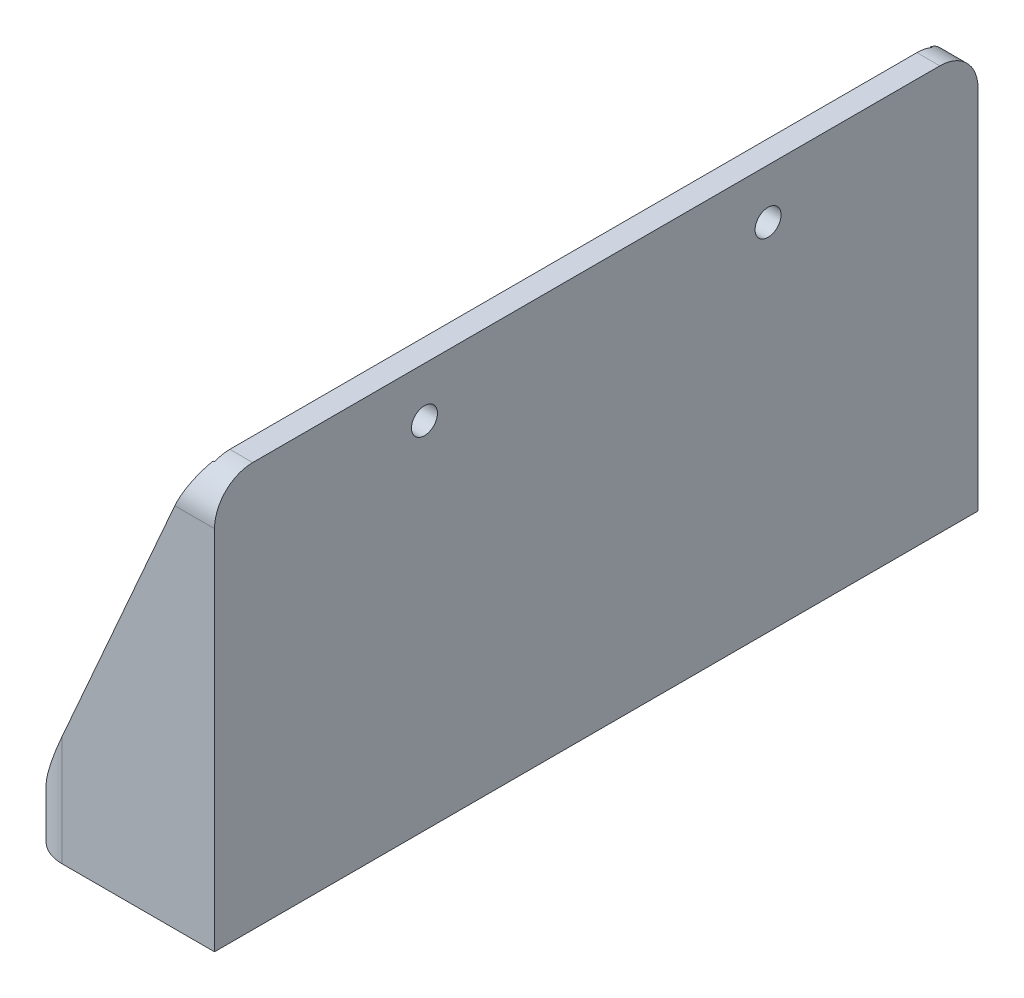
ISO-10303-21;
HEADER;
FILE_DESCRIPTION(('STEP AP214'),'2;1');
FILE_NAME('part.step','',(''),(''),'','','');
FILE_SCHEMA(('AUTOMOTIVE_DESIGN { 1 0 10303 214 1 1 1 1 }'));
ENDSEC;
DATA;
#1=APPLICATION_CONTEXT('core data for automotive mechanical design processes');
#2=APPLICATION_PROTOCOL_DEFINITION('international standard','automotive_design',2000,#1);
#3=PRODUCT_CONTEXT('',#1,'mechanical');
#4=PRODUCT('Part','Part','',(#3));
#5=PRODUCT_RELATED_PRODUCT_CATEGORY('part','',(#4));
#6=PRODUCT_DEFINITION_FORMATION('','',#4);
#7=PRODUCT_DEFINITION_CONTEXT('part definition',#1,'design');
#8=PRODUCT_DEFINITION('design','',#6,#7);
#9=PRODUCT_DEFINITION_SHAPE('','',#8);
#10=(LENGTH_UNIT() NAMED_UNIT(*) SI_UNIT(.MILLI.,.METRE.));
#11=(NAMED_UNIT(*) PLANE_ANGLE_UNIT() SI_UNIT($,.RADIAN.));
#12=(NAMED_UNIT(*) SI_UNIT($,.STERADIAN.) SOLID_ANGLE_UNIT());
#13=UNCERTAINTY_MEASURE_WITH_UNIT(LENGTH_MEASURE(1.E-05),#10,'distance_accuracy_value','');
#14=(GEOMETRIC_REPRESENTATION_CONTEXT(3) GLOBAL_UNCERTAINTY_ASSIGNED_CONTEXT((#13)) GLOBAL_UNIT_ASSIGNED_CONTEXT((#10,
#11,#12)) REPRESENTATION_CONTEXT('',''));
#15=CARTESIAN_POINT('',(0.,0.,0.));
#16=DIRECTION('',(0.,0.,1.));
#17=DIRECTION('',(1.,0.,0.));
#18=AXIS2_PLACEMENT_3D('',#15,#16,#17);
#19=CARTESIAN_POINT('',(0.,3.,0.));
#20=DIRECTION('',(0.,1.,0.));
#21=DIRECTION('',(0.,0.,1.));
#22=AXIS2_PLACEMENT_3D('',#19,#20,#21);
#23=PLANE('',#22);
#24=CARTESIAN_POINT('',(-1.5,3.,41.5792801519369));
#25=DIRECTION('',(0.,1.,0.));
#26=DIRECTION('',(0.,0.,1.));
#27=AXIS2_PLACEMENT_3D('',#24,#25,#26);
#28=CIRCLE('',#27,2.2);
#29=CARTESIAN_POINT('',(-1.5,3.,43.7792801519369));
#30=VERTEX_POINT('',#29);
#31=EDGE_CURVE('E258',#30,#30,#28,.T.);
#32=ORIENTED_EDGE('',*,*,#31,.F.);
#33=EDGE_LOOP('',(#32));
#34=FACE_BOUND('',#33,.T.);
#35=CARTESIAN_POINT('',(-1.5,3.,-38.4207198480631));
#36=DIRECTION('',(0.,1.,0.));
#37=DIRECTION('',(0.,0.,1.));
#38=AXIS2_PLACEMENT_3D('',#35,#36,#37);
#39=CIRCLE('',#38,2.2);
#40=CARTESIAN_POINT('',(-1.5,3.,-36.2207198480631));
#41=VERTEX_POINT('',#40);
#42=EDGE_CURVE('E261',#41,#41,#39,.T.);
#43=ORIENTED_EDGE('',*,*,#42,.F.);
#44=EDGE_LOOP('',(#43));
#45=FACE_BOUND('',#44,.T.);
#46=CARTESIAN_POINT('',(-1.5,3.,1.57928015193688));
#47=DIRECTION('',(0.,1.,0.));
#48=DIRECTION('',(0.,0.,1.));
#49=AXIS2_PLACEMENT_3D('',#46,#47,#48);
#50=CIRCLE('',#49,2.2);
#51=CARTESIAN_POINT('',(-1.5,3.,3.77928015193688));
#52=VERTEX_POINT('',#51);
#53=EDGE_CURVE('E264',#52,#52,#50,.T.);
#54=ORIENTED_EDGE('',*,*,#53,.F.);
#55=EDGE_LOOP('',(#54));
#56=FACE_BOUND('',#55,.T.);
#57=DIRECTION('',(0.,0.,1.));
#58=VECTOR('',#57,1.);
#59=CARTESIAN_POINT('',(-12.5,3.,50.));
#60=LINE('',#59,#58);
#61=CARTESIAN_POINT('',(-12.5,3.,-45.));
#62=VERTEX_POINT('',#61);
#63=CARTESIAN_POINT('',(-12.5,3.,45.));
#64=VERTEX_POINT('',#63);
#65=EDGE_CURVE('E286',#62,#64,#60,.T.);
#66=ORIENTED_EDGE('',*,*,#65,.T.);
#67=CARTESIAN_POINT('',(-7.5,3.,45.));
#68=DIRECTION('',(0.,1.,0.));
#69=DIRECTION('',(0.,0.,1.));
#70=AXIS2_PLACEMENT_3D('',#67,#68,#69);
#71=CIRCLE('',#70,5.);
#72=CARTESIAN_POINT('',(-12.0825756949558,3.,47.));
#73=VERTEX_POINT('',#72);
#74=EDGE_CURVE('E190',#64,#73,#71,.T.);
#75=ORIENTED_EDGE('',*,*,#74,.T.);
#76=DIRECTION('',(-1.,0.,0.));
#77=VECTOR('',#76,1.);
#78=CARTESIAN_POINT('',(0.,3.,47.));
#79=LINE('',#78,#77);
#80=CARTESIAN_POINT('',(4.50000000000001,3.,47.));
#81=VERTEX_POINT('',#80);
#82=EDGE_CURVE('E250',#81,#73,#79,.T.);
#83=ORIENTED_EDGE('',*,*,#82,.F.);
#84=DIRECTION('',(0.,0.,1.));
#85=VECTOR('',#84,1.);
#86=CARTESIAN_POINT('',(4.50000000000001,3.,0.));
#87=LINE('',#86,#85);
#88=CARTESIAN_POINT('',(4.50000000000001,3.,-47.));
#89=VERTEX_POINT('',#88);
#90=EDGE_CURVE('E164',#81,#89,#87,.F.);
#91=ORIENTED_EDGE('',*,*,#90,.T.);
#92=DIRECTION('',(-1.,0.,0.));
#93=VECTOR('',#92,1.);
#94=CARTESIAN_POINT('',(0.,3.,-47.));
#95=LINE('',#94,#93);
#96=CARTESIAN_POINT('',(-12.0825756949558,3.,-47.));
#97=VERTEX_POINT('',#96);
#98=EDGE_CURVE('E157',#89,#97,#95,.T.);
#99=ORIENTED_EDGE('',*,*,#98,.T.);
#100=CARTESIAN_POINT('',(-7.5,3.,-45.));
#101=DIRECTION('',(0.,1.,0.));
#102=DIRECTION('',(0.,0.,1.));
#103=AXIS2_PLACEMENT_3D('',#100,#101,#102);
#104=CIRCLE('',#103,5.);
#105=EDGE_CURVE('E188',#97,#62,#104,.T.);
#106=ORIENTED_EDGE('',*,*,#105,.T.);
#107=EDGE_LOOP('',(#66,#75,#83,#91,#99,#106));
#108=FACE_BOUND('',#107,.T.);
#109=ADVANCED_FACE('F35',(#34,#45,#56,#108),#23,.T.);
#110=CARTESIAN_POINT('',(9.5,53.,-50.));
#111=DIRECTION('',(1.,0.,0.));
#112=DIRECTION('',(0.,0.,-1.));
#113=AXIS2_PLACEMENT_3D('',#110,#111,#112);
#114=PLANE('',#113);
#115=CARTESIAN_POINT('',(9.5,46.5,-22.5));
#116=DIRECTION('',(-1.,0.,0.));
#117=DIRECTION('',(0.,0.,1.));
#118=AXIS2_PLACEMENT_3D('',#115,#116,#117);
#119=CIRCLE('',#118,1.7);
#120=CARTESIAN_POINT('',(9.5,46.5,-20.8));
#121=VERTEX_POINT('',#120);
#122=EDGE_CURVE('E270',#121,#121,#119,.T.);
#123=ORIENTED_EDGE('',*,*,#122,.F.);
#124=EDGE_LOOP('',(#123));
#125=FACE_BOUND('',#124,.T.);
#126=CARTESIAN_POINT('',(9.50000000000001,46.5,22.5));
#127=DIRECTION('',(-1.,0.,0.));
#128=DIRECTION('',(0.,0.,-1.));
#129=AXIS2_PLACEMENT_3D('',#126,#127,#128);
#130=CIRCLE('',#129,1.7);
#131=CARTESIAN_POINT('',(9.50000000000001,46.5,20.8));
#132=VERTEX_POINT('',#131);
#133=EDGE_CURVE('E274',#132,#132,#130,.T.);
#134=ORIENTED_EDGE('',*,*,#133,.F.);
#135=EDGE_LOOP('',(#134));
#136=FACE_BOUND('',#135,.T.);
#137=DIRECTION('',(0.,0.,1.));
#138=VECTOR('',#137,1.);
#139=CARTESIAN_POINT('',(9.5,53.,-50.));
#140=LINE('',#139,#138);
#141=CARTESIAN_POINT('',(9.5,53.,-45.));
#142=VERTEX_POINT('',#141);
#143=CARTESIAN_POINT('',(9.50000000000001,53.,45.));
#144=VERTEX_POINT('',#143);
#145=EDGE_CURVE('E283',#142,#144,#140,.T.);
#146=ORIENTED_EDGE('',*,*,#145,.F.);
#147=CARTESIAN_POINT('',(9.5,48.,-45.));
#148=DIRECTION('',(1.,0.,0.));
#149=DIRECTION('',(0.,0.,-1.));
#150=AXIS2_PLACEMENT_3D('',#147,#148,#149);
#151=CIRCLE('',#150,5.);
#152=CARTESIAN_POINT('',(9.50000000000001,52.5825756949558,-47.));
#153=VERTEX_POINT('',#152);
#154=EDGE_CURVE('E58',#142,#153,#151,.F.);
#155=ORIENTED_EDGE('',*,*,#154,.T.);
#156=DIRECTION('',(0.,-1.,0.));
#157=VECTOR('',#156,1.);
#158=CARTESIAN_POINT('',(9.50000000000001,0.,-47.));
#159=LINE('',#158,#157);
#160=CARTESIAN_POINT('',(9.50000000000001,8.,-47.));
#161=VERTEX_POINT('',#160);
#162=EDGE_CURVE('E143',#153,#161,#159,.T.);
#163=ORIENTED_EDGE('',*,*,#162,.T.);
#164=DIRECTION('',(0.,0.,1.));
#165=VECTOR('',#164,1.);
#166=CARTESIAN_POINT('',(9.5,8.,-50.));
#167=LINE('',#166,#165);
#168=CARTESIAN_POINT('',(9.50000000000001,8.,47.));
#169=VERTEX_POINT('',#168);
#170=EDGE_CURVE('E147',#161,#169,#167,.T.);
#171=ORIENTED_EDGE('',*,*,#170,.T.);
#172=DIRECTION('',(0.,-1.,0.));
#173=VECTOR('',#172,1.);
#174=CARTESIAN_POINT('',(9.50000000000001,0.,47.));
#175=LINE('',#174,#173);
#176=CARTESIAN_POINT('',(9.50000000000001,52.5825756949558,47.));
#177=VERTEX_POINT('',#176);
#178=EDGE_CURVE('E251',#177,#169,#175,.T.);
#179=ORIENTED_EDGE('',*,*,#178,.F.);
#180=CARTESIAN_POINT('',(9.50000000000001,48.,45.));
#181=DIRECTION('',(1.,0.,0.));
#182=DIRECTION('',(0.,0.,-1.));
#183=AXIS2_PLACEMENT_3D('',#180,#181,#182);
#184=CIRCLE('',#183,5.);
#185=EDGE_CURVE('E50',#177,#144,#184,.F.);
#186=ORIENTED_EDGE('',*,*,#185,.T.);
#187=EDGE_LOOP('',(#146,#155,#163,#171,#179,#186));
#188=FACE_BOUND('',#187,.T.);
#189=ADVANCED_FACE('F145',(#125,#136,#188),#114,.F.);
#190=CARTESIAN_POINT('',(4.5,8.,-50.));
#191=DIRECTION('',(0.,0.,1.));
#192=DIRECTION('',(1.,0.,0.));
#193=AXIS2_PLACEMENT_3D('',#190,#191,#192);
#194=CYLINDRICAL_SURFACE('',#193,5.);
#195=CARTESIAN_POINT('',(4.50000000000001,8.,-47.));
#196=DIRECTION('',(0.,0.,1.));
#197=DIRECTION('',(1.,0.,0.));
#198=AXIS2_PLACEMENT_3D('',#195,#196,#197);
#199=CIRCLE('',#198,5.);
#200=EDGE_CURVE('E150',#161,#89,#199,.F.);
#201=ORIENTED_EDGE('',*,*,#200,.T.);
#202=ORIENTED_EDGE('',*,*,#90,.F.);
#203=CARTESIAN_POINT('',(4.50000000000001,8.,47.));
#204=DIRECTION('',(0.,0.,1.));
#205=DIRECTION('',(1.,0.,0.));
#206=AXIS2_PLACEMENT_3D('',#203,#204,#205);
#207=CIRCLE('',#206,5.);
#208=EDGE_CURVE('E163',#169,#81,#207,.F.);
#209=ORIENTED_EDGE('',*,*,#208,.F.);
#210=ORIENTED_EDGE('',*,*,#170,.F.);
#211=EDGE_LOOP('',(#201,#202,#209,#210));
#212=FACE_BOUND('',#211,.T.);
#213=ADVANCED_FACE('F162',(#212),#194,.F.);
#214=CARTESIAN_POINT('',(-12.5,3.,50.));
#215=DIRECTION('',(1.,0.,0.));
#216=DIRECTION('',(0.,0.,-1.));
#217=AXIS2_PLACEMENT_3D('',#214,#215,#216);
#218=PLANE('',#217);
#219=DIRECTION('',(0.,0.,1.));
#220=VECTOR('',#219,1.);
#221=CARTESIAN_POINT('',(-12.5,0.,50.));
#222=LINE('',#221,#220);
#223=CARTESIAN_POINT('',(-12.5,0.,-45.));
#224=VERTEX_POINT('',#223);
#225=CARTESIAN_POINT('',(-12.5,0.,45.));
#226=VERTEX_POINT('',#225);
#227=EDGE_CURVE('E285',#224,#226,#222,.T.);
#228=ORIENTED_EDGE('',*,*,#227,.T.);
#229=DIRECTION('',(0.,-1.,0.));
#230=VECTOR('',#229,1.);
#231=CARTESIAN_POINT('',(-12.5,3.,45.));
#232=LINE('',#231,#230);
#233=EDGE_CURVE('E186',#226,#64,#232,.F.);
#234=ORIENTED_EDGE('',*,*,#233,.T.);
#235=ORIENTED_EDGE('',*,*,#65,.F.);
#236=DIRECTION('',(0.,-1.,0.));
#237=VECTOR('',#236,1.);
#238=CARTESIAN_POINT('',(-12.5,3.,-45.));
#239=LINE('',#238,#237);
#240=EDGE_CURVE('E183',#62,#224,#239,.T.);
#241=ORIENTED_EDGE('',*,*,#240,.T.);
#242=EDGE_LOOP('',(#228,#234,#235,#241));
#243=FACE_BOUND('',#242,.T.);
#244=ADVANCED_FACE('F348',(#243),#218,.F.);
#245=CARTESIAN_POINT('',(12.5,3.,50.));
#246=DIRECTION('',(0.,0.,-1.));
#247=DIRECTION('',(-1.,0.,0.));
#248=AXIS2_PLACEMENT_3D('',#245,#246,#247);
#249=PLANE('',#248);
#250=DIRECTION('',(-0.402738614266017,-0.915315032422766,0.));
#251=VECTOR('',#250,1.);
#252=CARTESIAN_POINT('',(-11.578418230563,5.09450402144773,50.));
#253=LINE('',#252,#251);
#254=CARTESIAN_POINT('',(7.30000000000002,48.,50.));
#255=VERTEX_POINT('',#254);
#256=CARTESIAN_POINT('',(-7.5,14.3636363636364,50.));
#257=VERTEX_POINT('',#256);
#258=EDGE_CURVE('E245',#255,#257,#253,.T.);
#259=ORIENTED_EDGE('',*,*,#258,.T.);
#260=DIRECTION('',(0.,-1.,0.));
#261=VECTOR('',#260,1.);
#262=CARTESIAN_POINT('',(-7.5,3.,50.));
#263=LINE('',#262,#261);
#264=CARTESIAN_POINT('',(-7.5,0.,50.));
#265=VERTEX_POINT('',#264);
#266=EDGE_CURVE('E176',#257,#265,#263,.T.);
#267=ORIENTED_EDGE('',*,*,#266,.T.);
#268=DIRECTION('',(1.,0.,0.));
#269=VECTOR('',#268,1.);
#270=CARTESIAN_POINT('',(12.5,0.,50.));
#271=LINE('',#270,#269);
#272=CARTESIAN_POINT('',(12.5,0.,50.));
#273=VERTEX_POINT('',#272);
#274=EDGE_CURVE('E235',#265,#273,#271,.T.);
#275=ORIENTED_EDGE('',*,*,#274,.T.);
#276=DIRECTION('',(0.,-1.,0.));
#277=VECTOR('',#276,1.);
#278=CARTESIAN_POINT('',(12.5,3.,50.));
#279=LINE('',#278,#277);
#280=CARTESIAN_POINT('',(12.5,48.,50.));
#281=VERTEX_POINT('',#280);
#282=EDGE_CURVE('E165',#281,#273,#279,.T.);
#283=ORIENTED_EDGE('',*,*,#282,.F.);
#284=DIRECTION('',(1.,0.,0.));
#285=VECTOR('',#284,1.);
#286=CARTESIAN_POINT('',(12.5,48.,50.));
#287=LINE('',#286,#285);
#288=EDGE_CURVE('E167',#281,#255,#287,.F.);
#289=ORIENTED_EDGE('',*,*,#288,.T.);
#290=EDGE_LOOP('',(#259,#267,#275,#283,#289));
#291=FACE_BOUND('',#290,.T.);
#292=ADVANCED_FACE('F232',(#291),#249,.F.);
#293=CARTESIAN_POINT('',(12.5,3.,50.));
#294=DIRECTION('',(-1.,0.,0.));
#295=DIRECTION('',(0.,0.,1.));
#296=AXIS2_PLACEMENT_3D('',#293,#294,#295);
#297=PLANE('',#296);
#298=CARTESIAN_POINT('',(12.5,46.5,-22.5));
#299=DIRECTION('',(-1.,0.,0.));
#300=DIRECTION('',(0.,0.,1.));
#301=AXIS2_PLACEMENT_3D('',#298,#299,#300);
#302=CIRCLE('',#301,1.7);
#303=CARTESIAN_POINT('',(12.5,46.5,-20.8));
#304=VERTEX_POINT('',#303);
#305=EDGE_CURVE('E279',#304,#304,#302,.T.);
#306=ORIENTED_EDGE('',*,*,#305,.T.);
#307=EDGE_LOOP('',(#306));
#308=FACE_BOUND('',#307,.T.);
#309=CARTESIAN_POINT('',(12.5,46.5,22.5));
#310=DIRECTION('',(-1.,0.,0.));
#311=DIRECTION('',(0.,0.,1.));
#312=AXIS2_PLACEMENT_3D('',#309,#310,#311);
#313=CIRCLE('',#312,1.7);
#314=CARTESIAN_POINT('',(12.5,46.5,24.2));
#315=VERTEX_POINT('',#314);
#316=EDGE_CURVE('E273',#315,#315,#313,.T.);
#317=ORIENTED_EDGE('',*,*,#316,.T.);
#318=EDGE_LOOP('',(#317));
#319=FACE_BOUND('',#318,.T.);
#320=DIRECTION('',(0.,-1.,0.));
#321=VECTOR('',#320,1.);
#322=CARTESIAN_POINT('',(12.5,3.,-50.));
#323=LINE('',#322,#321);
#324=CARTESIAN_POINT('',(12.5,48.,-50.));
#325=VERTEX_POINT('',#324);
#326=CARTESIAN_POINT('',(12.5,0.,-50.));
#327=VERTEX_POINT('',#326);
#328=EDGE_CURVE('E169',#325,#327,#323,.T.);
#329=ORIENTED_EDGE('',*,*,#328,.F.);
#330=CARTESIAN_POINT('',(12.5,48.,-45.));
#331=DIRECTION('',(-1.,0.,0.));
#332=DIRECTION('',(0.,0.,1.));
#333=AXIS2_PLACEMENT_3D('',#330,#331,#332);
#334=CIRCLE('',#333,5.);
#335=CARTESIAN_POINT('',(12.5,53.,-45.));
#336=VERTEX_POINT('',#335);
#337=EDGE_CURVE('E11',#325,#336,#334,.F.);
#338=ORIENTED_EDGE('',*,*,#337,.T.);
#339=DIRECTION('',(0.,0.,-1.));
#340=VECTOR('',#339,1.);
#341=CARTESIAN_POINT('',(12.5,53.,-50.));
#342=LINE('',#341,#340);
#343=CARTESIAN_POINT('',(12.5,53.,45.));
#344=VERTEX_POINT('',#343);
#345=EDGE_CURVE('E226',#344,#336,#342,.T.);
#346=ORIENTED_EDGE('',*,*,#345,.F.);
#347=CARTESIAN_POINT('',(12.5,48.,45.));
#348=DIRECTION('',(-1.,0.,0.));
#349=DIRECTION('',(0.,0.,1.));
#350=AXIS2_PLACEMENT_3D('',#347,#348,#349);
#351=CIRCLE('',#350,5.);
#352=EDGE_CURVE('E43',#344,#281,#351,.F.);
#353=ORIENTED_EDGE('',*,*,#352,.T.);
#354=ORIENTED_EDGE('',*,*,#282,.T.);
#355=DIRECTION('',(0.,0.,-1.));
#356=VECTOR('',#355,1.);
#357=CARTESIAN_POINT('',(12.5,0.,50.));
#358=LINE('',#357,#356);
#359=EDGE_CURVE('E293',#273,#327,#358,.T.);
#360=ORIENTED_EDGE('',*,*,#359,.T.);
#361=EDGE_LOOP('',(#329,#338,#346,#353,#354,#360));
#362=FACE_BOUND('',#361,.T.);
#363=ADVANCED_FACE('F222',(#308,#319,#362),#297,.F.);
#364=CARTESIAN_POINT('',(12.5,3.,-50.));
#365=DIRECTION('',(0.,0.,1.));
#366=DIRECTION('',(1.,0.,0.));
#367=AXIS2_PLACEMENT_3D('',#364,#365,#366);
#368=PLANE('',#367);
#369=DIRECTION('',(-1.,0.,0.));
#370=VECTOR('',#369,1.);
#371=CARTESIAN_POINT('',(12.5,0.,-50.));
#372=LINE('',#371,#370);
#373=CARTESIAN_POINT('',(-7.5,0.,-50.));
#374=VERTEX_POINT('',#373);
#375=EDGE_CURVE('E289',#327,#374,#372,.T.);
#376=ORIENTED_EDGE('',*,*,#375,.T.);
#377=DIRECTION('',(0.,-1.,0.));
#378=VECTOR('',#377,1.);
#379=CARTESIAN_POINT('',(-7.5,3.,-50.));
#380=LINE('',#379,#378);
#381=CARTESIAN_POINT('',(-7.5,14.3636363636364,-50.));
#382=VERTEX_POINT('',#381);
#383=EDGE_CURVE('E202',#374,#382,#380,.F.);
#384=ORIENTED_EDGE('',*,*,#383,.T.);
#385=DIRECTION('',(-0.402738614266017,-0.915315032422766,0.));
#386=VECTOR('',#385,1.);
#387=CARTESIAN_POINT('',(-11.578418230563,5.09450402144773,-50.));
#388=LINE('',#387,#386);
#389=CARTESIAN_POINT('',(7.30000000000002,48.,-50.));
#390=VERTEX_POINT('',#389);
#391=EDGE_CURVE('E151',#390,#382,#388,.T.);
#392=ORIENTED_EDGE('',*,*,#391,.F.);
#393=DIRECTION('',(-1.,0.,0.));
#394=VECTOR('',#393,1.);
#395=CARTESIAN_POINT('',(12.5,48.,-50.));
#396=LINE('',#395,#394);
#397=EDGE_CURVE('E200',#390,#325,#396,.F.);
#398=ORIENTED_EDGE('',*,*,#397,.T.);
#399=ORIENTED_EDGE('',*,*,#328,.T.);
#400=EDGE_LOOP('',(#376,#384,#392,#398,#399));
#401=FACE_BOUND('',#400,.T.);
#402=ADVANCED_FACE('F339',(#401),#368,.F.);
#403=CARTESIAN_POINT('',(0.,0.,0.));
#404=DIRECTION('',(0.,1.,0.));
#405=DIRECTION('',(0.,0.,1.));
#406=AXIS2_PLACEMENT_3D('',#403,#404,#405);
#407=PLANE('',#406);
#408=CARTESIAN_POINT('',(-1.5,0.,41.5792801519369));
#409=DIRECTION('',(0.,1.,0.));
#410=DIRECTION('',(0.,0.,1.));
#411=AXIS2_PLACEMENT_3D('',#408,#409,#410);
#412=CIRCLE('',#411,2.2);
#413=CARTESIAN_POINT('',(-1.5,0.,43.7792801519369));
#414=VERTEX_POINT('',#413);
#415=EDGE_CURVE('E172',#414,#414,#412,.T.);
#416=ORIENTED_EDGE('',*,*,#415,.T.);
#417=EDGE_LOOP('',(#416));
#418=FACE_BOUND('',#417,.T.);
#419=CARTESIAN_POINT('',(-1.5,0.,-38.4207198480631));
#420=DIRECTION('',(0.,1.,0.));
#421=DIRECTION('',(0.,0.,1.));
#422=AXIS2_PLACEMENT_3D('',#419,#420,#421);
#423=CIRCLE('',#422,2.2);
#424=CARTESIAN_POINT('',(-1.5,0.,-36.2207198480631));
#425=VERTEX_POINT('',#424);
#426=EDGE_CURVE('E299',#425,#425,#423,.T.);
#427=ORIENTED_EDGE('',*,*,#426,.T.);
#428=EDGE_LOOP('',(#427));
#429=FACE_BOUND('',#428,.T.);
#430=CARTESIAN_POINT('',(-1.5,0.,1.57928015193688));
#431=DIRECTION('',(0.,1.,0.));
#432=DIRECTION('',(0.,0.,1.));
#433=AXIS2_PLACEMENT_3D('',#430,#431,#432);
#434=CIRCLE('',#433,2.2);
#435=CARTESIAN_POINT('',(-1.5,0.,3.77928015193688));
#436=VERTEX_POINT('',#435);
#437=EDGE_CURVE('E269',#436,#436,#434,.T.);
#438=ORIENTED_EDGE('',*,*,#437,.T.);
#439=EDGE_LOOP('',(#438));
#440=FACE_BOUND('',#439,.T.);
#441=ORIENTED_EDGE('',*,*,#274,.F.);
#442=CARTESIAN_POINT('',(-7.5,0.,45.));
#443=DIRECTION('',(0.,1.,0.));
#444=DIRECTION('',(0.,0.,1.));
#445=AXIS2_PLACEMENT_3D('',#442,#443,#444);
#446=CIRCLE('',#445,5.);
#447=EDGE_CURVE('E181',#265,#226,#446,.F.);
#448=ORIENTED_EDGE('',*,*,#447,.T.);
#449=ORIENTED_EDGE('',*,*,#227,.F.);
#450=CARTESIAN_POINT('',(-7.5,0.,-45.));
#451=DIRECTION('',(0.,1.,0.));
#452=DIRECTION('',(0.,0.,1.));
#453=AXIS2_PLACEMENT_3D('',#450,#451,#452);
#454=CIRCLE('',#453,5.);
#455=EDGE_CURVE('E179',#224,#374,#454,.F.);
#456=ORIENTED_EDGE('',*,*,#455,.T.);
#457=ORIENTED_EDGE('',*,*,#375,.F.);
#458=ORIENTED_EDGE('',*,*,#359,.F.);
#459=EDGE_LOOP('',(#441,#448,#449,#456,#457,#458));
#460=FACE_BOUND('',#459,.T.);
#461=ADVANCED_FACE('F306',(#418,#429,#440,#460),#407,.F.);
#462=CARTESIAN_POINT('',(0.,53.,0.));
#463=DIRECTION('',(0.,-1.,0.));
#464=DIRECTION('',(0.,0.,-1.));
#465=AXIS2_PLACEMENT_3D('',#462,#463,#464);
#466=PLANE('',#465);
#467=ORIENTED_EDGE('',*,*,#345,.T.);
#468=DIRECTION('',(-1.,0.,0.));
#469=VECTOR('',#468,1.);
#470=CARTESIAN_POINT('',(0.,53.,-45.));
#471=LINE('',#470,#469);
#472=EDGE_CURVE('E215',#336,#142,#471,.T.);
#473=ORIENTED_EDGE('',*,*,#472,.T.);
#474=ORIENTED_EDGE('',*,*,#145,.T.);
#475=DIRECTION('',(1.,0.,0.));
#476=VECTOR('',#475,1.);
#477=CARTESIAN_POINT('',(0.,53.,45.));
#478=LINE('',#477,#476);
#479=EDGE_CURVE('E212',#144,#344,#478,.T.);
#480=ORIENTED_EDGE('',*,*,#479,.T.);
#481=EDGE_LOOP('',(#467,#473,#474,#480));
#482=FACE_BOUND('',#481,.T.);
#483=ADVANCED_FACE('F338',(#482),#466,.F.);
#484=CARTESIAN_POINT('',(34.5,46.5,22.5));
#485=DIRECTION('',(-1.,0.,0.));
#486=DIRECTION('',(0.,0.,1.));
#487=AXIS2_PLACEMENT_3D('',#484,#485,#486);
#488=CYLINDRICAL_SURFACE('',#487,1.7);
#489=ORIENTED_EDGE('',*,*,#133,.T.);
#490=EDGE_LOOP('',(#489));
#491=FACE_BOUND('',#490,.T.);
#492=ORIENTED_EDGE('',*,*,#316,.F.);
#493=EDGE_LOOP('',(#492));
#494=FACE_BOUND('',#493,.T.);
#495=ADVANCED_FACE('F371',(#491,#494),#488,.F.);
#496=CARTESIAN_POINT('',(34.5,46.5,-22.5));
#497=DIRECTION('',(-1.,0.,0.));
#498=DIRECTION('',(0.,0.,1.));
#499=AXIS2_PLACEMENT_3D('',#496,#497,#498);
#500=CYLINDRICAL_SURFACE('',#499,1.7);
#501=ORIENTED_EDGE('',*,*,#122,.T.);
#502=EDGE_LOOP('',(#501));
#503=FACE_BOUND('',#502,.T.);
#504=ORIENTED_EDGE('',*,*,#305,.F.);
#505=EDGE_LOOP('',(#504));
#506=FACE_BOUND('',#505,.T.);
#507=ADVANCED_FACE('F375',(#503,#506),#500,.F.);
#508=CARTESIAN_POINT('',(-1.5,-22.,1.57928015193688));
#509=DIRECTION('',(0.,1.,0.));
#510=DIRECTION('',(0.,0.,1.));
#511=AXIS2_PLACEMENT_3D('',#508,#509,#510);
#512=CYLINDRICAL_SURFACE('',#511,2.2);
#513=ORIENTED_EDGE('',*,*,#53,.T.);
#514=EDGE_LOOP('',(#513));
#515=FACE_BOUND('',#514,.T.);
#516=ORIENTED_EDGE('',*,*,#437,.F.);
#517=EDGE_LOOP('',(#516));
#518=FACE_BOUND('',#517,.T.);
#519=ADVANCED_FACE('F319',(#515,#518),#512,.F.);
#520=CARTESIAN_POINT('',(-1.5,-22.,-38.4207198480631));
#521=DIRECTION('',(0.,1.,0.));
#522=DIRECTION('',(0.,0.,1.));
#523=AXIS2_PLACEMENT_3D('',#520,#521,#522);
#524=CYLINDRICAL_SURFACE('',#523,2.2);
#525=ORIENTED_EDGE('',*,*,#42,.T.);
#526=EDGE_LOOP('',(#525));
#527=FACE_BOUND('',#526,.T.);
#528=ORIENTED_EDGE('',*,*,#426,.F.);
#529=EDGE_LOOP('',(#528));
#530=FACE_BOUND('',#529,.T.);
#531=ADVANCED_FACE('F310',(#527,#530),#524,.F.);
#532=CARTESIAN_POINT('',(-1.5,-22.,41.5792801519369));
#533=DIRECTION('',(0.,1.,0.));
#534=DIRECTION('',(0.,0.,1.));
#535=AXIS2_PLACEMENT_3D('',#532,#533,#534);
#536=CYLINDRICAL_SURFACE('',#535,2.2);
#537=ORIENTED_EDGE('',*,*,#31,.T.);
#538=EDGE_LOOP('',(#537));
#539=FACE_BOUND('',#538,.T.);
#540=ORIENTED_EDGE('',*,*,#415,.F.);
#541=EDGE_LOOP('',(#540));
#542=FACE_BOUND('',#541,.T.);
#543=ADVANCED_FACE('F308',(#539,#542),#536,.F.);
#544=CARTESIAN_POINT('',(-11.578418230563,5.09450402144773,47.));
#545=DIRECTION('',(-0.915315032422766,0.402738614266017,0.));
#546=DIRECTION('',(-0.402738614266017,-0.915315032422766,0.));
#547=AXIS2_PLACEMENT_3D('',#544,#545,#546);
#548=PLANE('',#547);
#549=DIRECTION('',(-0.402738614266017,-0.915315032422766,0.));
#550=VECTOR('',#549,1.);
#551=CARTESIAN_POINT('',(-11.578418230563,5.09450402144773,47.));
#552=LINE('',#551,#550);
#553=CARTESIAN_POINT('',(9.31633330578059,52.5825756949559,47.));
#554=VERTEX_POINT('',#553);
#555=CARTESIAN_POINT('',(-12.0825756949558,3.9486916023731,47.));
#556=VERTEX_POINT('',#555);
#557=EDGE_CURVE('E243',#554,#556,#552,.T.);
#558=ORIENTED_EDGE('',*,*,#557,.T.);
#559=CARTESIAN_POINT('',(-7.5,14.3636363636364,45.));
#560=DIRECTION('',(-0.915315032422766,0.402738614266017,0.));
#561=DIRECTION('',(-0.402738614266017,-0.915315032422766,0.));
#562=AXIS2_PLACEMENT_3D('',#559,#560,#561);
#563=ELLIPSE('',#562,12.4150002579524,5.);
#564=EDGE_CURVE('E198',#556,#257,#563,.T.);
#565=ORIENTED_EDGE('',*,*,#564,.T.);
#566=ORIENTED_EDGE('',*,*,#258,.F.);
#567=CARTESIAN_POINT('',(7.30000000000001,48.,45.));
#568=DIRECTION('',(-0.915315032422766,0.402738614266017,0.));
#569=DIRECTION('',(0.402738614266017,0.915315032422766,0.));
#570=AXIS2_PLACEMENT_3D('',#567,#568,#569);
#571=ELLIPSE('',#570,5.46260011349907,5.);
#572=EDGE_CURVE('E196',#255,#554,#571,.T.);
#573=ORIENTED_EDGE('',*,*,#572,.T.);
#574=EDGE_LOOP('',(#558,#565,#566,#573));
#575=FACE_BOUND('',#574,.T.);
#576=ADVANCED_FACE('F242',(#575),#548,.T.);
#577=CARTESIAN_POINT('',(0.,0.,47.));
#578=DIRECTION('',(0.,0.,1.));
#579=DIRECTION('',(1.,0.,0.));
#580=AXIS2_PLACEMENT_3D('',#577,#578,#579);
#581=PLANE('',#580);
#582=ORIENTED_EDGE('',*,*,#82,.T.);
#583=DIRECTION('',(0.,-1.,0.));
#584=VECTOR('',#583,1.);
#585=CARTESIAN_POINT('',(-12.0825756949558,3.,47.));
#586=LINE('',#585,#584);
#587=EDGE_CURVE('E194',#73,#556,#586,.F.);
#588=ORIENTED_EDGE('',*,*,#587,.T.);
#589=ORIENTED_EDGE('',*,*,#557,.F.);
#590=DIRECTION('',(1.,0.,0.));
#591=VECTOR('',#590,1.);
#592=CARTESIAN_POINT('',(9.31633330578059,52.5825756949559,47.));
#593=LINE('',#592,#591);
#594=EDGE_CURVE('E192',#554,#177,#593,.T.);
#595=ORIENTED_EDGE('',*,*,#594,.T.);
#596=ORIENTED_EDGE('',*,*,#178,.T.);
#597=ORIENTED_EDGE('',*,*,#208,.T.);
#598=EDGE_LOOP('',(#582,#588,#589,#595,#596,#597));
#599=FACE_BOUND('',#598,.T.);
#600=ADVANCED_FACE('F248',(#599),#581,.F.);
#601=CARTESIAN_POINT('',(-11.578418230563,5.09450402144773,-47.));
#602=DIRECTION('',(0.915315032422766,-0.402738614266017,0.));
#603=DIRECTION('',(0.402738614266017,0.915315032422766,0.));
#604=AXIS2_PLACEMENT_3D('',#601,#602,#603);
#605=PLANE('',#604);
#606=ORIENTED_EDGE('',*,*,#391,.T.);
#607=CARTESIAN_POINT('',(-7.5,14.3636363636364,-45.));
#608=DIRECTION('',(0.915315032422766,-0.402738614266017,0.));
#609=DIRECTION('',(-0.402738614266017,-0.915315032422766,0.));
#610=AXIS2_PLACEMENT_3D('',#607,#608,#609);
#611=ELLIPSE('',#610,12.4150002579524,5.);
#612=CARTESIAN_POINT('',(-12.0825756949558,3.9486916023731,-47.));
#613=VERTEX_POINT('',#612);
#614=EDGE_CURVE('E206',#382,#613,#611,.F.);
#615=ORIENTED_EDGE('',*,*,#614,.T.);
#616=DIRECTION('',(-0.402738614266017,-0.915315032422766,0.));
#617=VECTOR('',#616,1.);
#618=CARTESIAN_POINT('',(-11.578418230563,5.09450402144773,-47.));
#619=LINE('',#618,#617);
#620=CARTESIAN_POINT('',(9.31633330578058,52.5825756949558,-47.));
#621=VERTEX_POINT('',#620);
#622=EDGE_CURVE('E260',#621,#613,#619,.T.);
#623=ORIENTED_EDGE('',*,*,#622,.F.);
#624=CARTESIAN_POINT('',(7.30000000000001,48.,-45.));
#625=DIRECTION('',(0.915315032422766,-0.402738614266017,0.));
#626=DIRECTION('',(-0.402738614266017,-0.915315032422766,0.));
#627=AXIS2_PLACEMENT_3D('',#624,#625,#626);
#628=ELLIPSE('',#627,5.46260011349907,5.);
#629=EDGE_CURVE('E204',#621,#390,#628,.F.);
#630=ORIENTED_EDGE('',*,*,#629,.T.);
#631=EDGE_LOOP('',(#606,#615,#623,#630));
#632=FACE_BOUND('',#631,.T.);
#633=ADVANCED_FACE('F401',(#632),#605,.F.);
#634=CARTESIAN_POINT('',(0.,0.,-47.));
#635=DIRECTION('',(0.,0.,-1.));
#636=DIRECTION('',(1.,0.,0.));
#637=AXIS2_PLACEMENT_3D('',#634,#635,#636);
#638=PLANE('',#637);
#639=ORIENTED_EDGE('',*,*,#622,.T.);
#640=DIRECTION('',(0.,-1.,0.));
#641=VECTOR('',#640,1.);
#642=CARTESIAN_POINT('',(-12.0825756949558,3.9486916023731,-47.));
#643=LINE('',#642,#641);
#644=EDGE_CURVE('E210',#613,#97,#643,.T.);
#645=ORIENTED_EDGE('',*,*,#644,.T.);
#646=ORIENTED_EDGE('',*,*,#98,.F.);
#647=ORIENTED_EDGE('',*,*,#200,.F.);
#648=ORIENTED_EDGE('',*,*,#162,.F.);
#649=DIRECTION('',(-1.,0.,0.));
#650=VECTOR('',#649,1.);
#651=CARTESIAN_POINT('',(9.50000000000001,52.5825756949558,-47.));
#652=LINE('',#651,#650);
#653=EDGE_CURVE('E208',#153,#621,#652,.T.);
#654=ORIENTED_EDGE('',*,*,#653,.T.);
#655=EDGE_LOOP('',(#639,#645,#646,#647,#648,#654));
#656=FACE_BOUND('',#655,.T.);
#657=ADVANCED_FACE('F155',(#656),#638,.F.);
#658=CARTESIAN_POINT('',(-7.5,3.,45.));
#659=DIRECTION('',(0.,-1.,0.));
#660=DIRECTION('',(0.,0.,-1.));
#661=AXIS2_PLACEMENT_3D('',#658,#659,#660);
#662=CYLINDRICAL_SURFACE('',#661,5.);
#663=ORIENTED_EDGE('',*,*,#74,.F.);
#664=ORIENTED_EDGE('',*,*,#233,.F.);
#665=ORIENTED_EDGE('',*,*,#447,.F.);
#666=ORIENTED_EDGE('',*,*,#266,.F.);
#667=ORIENTED_EDGE('',*,*,#564,.F.);
#668=ORIENTED_EDGE('',*,*,#587,.F.);
#669=EDGE_LOOP('',(#663,#664,#665,#666,#667,#668));
#670=FACE_BOUND('',#669,.T.);
#671=ADVANCED_FACE('F354',(#670),#662,.T.);
#672=CARTESIAN_POINT('',(-7.5,3.,-45.));
#673=DIRECTION('',(0.,-1.,0.));
#674=DIRECTION('',(0.,0.,-1.));
#675=AXIS2_PLACEMENT_3D('',#672,#673,#674);
#676=CYLINDRICAL_SURFACE('',#675,5.);
#677=ORIENTED_EDGE('',*,*,#614,.F.);
#678=ORIENTED_EDGE('',*,*,#383,.F.);
#679=ORIENTED_EDGE('',*,*,#455,.F.);
#680=ORIENTED_EDGE('',*,*,#240,.F.);
#681=ORIENTED_EDGE('',*,*,#105,.F.);
#682=ORIENTED_EDGE('',*,*,#644,.F.);
#683=EDGE_LOOP('',(#677,#678,#679,#680,#681,#682));
#684=FACE_BOUND('',#683,.T.);
#685=ADVANCED_FACE('F357',(#684),#676,.T.);
#686=CARTESIAN_POINT('',(0.,48.,-45.));
#687=DIRECTION('',(-1.,0.,0.));
#688=DIRECTION('',(0.,0.,1.));
#689=AXIS2_PLACEMENT_3D('',#686,#687,#688);
#690=CYLINDRICAL_SURFACE('',#689,5.);
#691=ORIENTED_EDGE('',*,*,#337,.F.);
#692=ORIENTED_EDGE('',*,*,#397,.F.);
#693=ORIENTED_EDGE('',*,*,#629,.F.);
#694=ORIENTED_EDGE('',*,*,#653,.F.);
#695=ORIENTED_EDGE('',*,*,#154,.F.);
#696=ORIENTED_EDGE('',*,*,#472,.F.);
#697=EDGE_LOOP('',(#691,#692,#693,#694,#695,#696));
#698=FACE_BOUND('',#697,.T.);
#699=ADVANCED_FACE('F360',(#698),#690,.T.);
#700=CARTESIAN_POINT('',(0.,48.,45.));
#701=DIRECTION('',(1.,0.,0.));
#702=DIRECTION('',(0.,0.,-1.));
#703=AXIS2_PLACEMENT_3D('',#700,#701,#702);
#704=CYLINDRICAL_SURFACE('',#703,5.);
#705=ORIENTED_EDGE('',*,*,#572,.F.);
#706=ORIENTED_EDGE('',*,*,#288,.F.);
#707=ORIENTED_EDGE('',*,*,#352,.F.);
#708=ORIENTED_EDGE('',*,*,#479,.F.);
#709=ORIENTED_EDGE('',*,*,#185,.F.);
#710=ORIENTED_EDGE('',*,*,#594,.F.);
#711=EDGE_LOOP('',(#705,#706,#707,#708,#709,#710));
#712=FACE_BOUND('',#711,.T.);
#713=ADVANCED_FACE('F37',(#712),#704,.T.);
#714=CLOSED_SHELL('',(#109,#189,#213,#244,#292,#363,#402,#461,#483,#495,#507,#519,#531,#543,
#576,#600,#633,#657,#671,#685,#699,#713));
#715=MANIFOLD_SOLID_BREP('B2',#714);
#716=ADVANCED_BREP_SHAPE_REPRESENTATION('',(#18,#715),#14);
#717=SHAPE_DEFINITION_REPRESENTATION(#9,#716);
ENDSEC;
END-ISO-10303-21;
